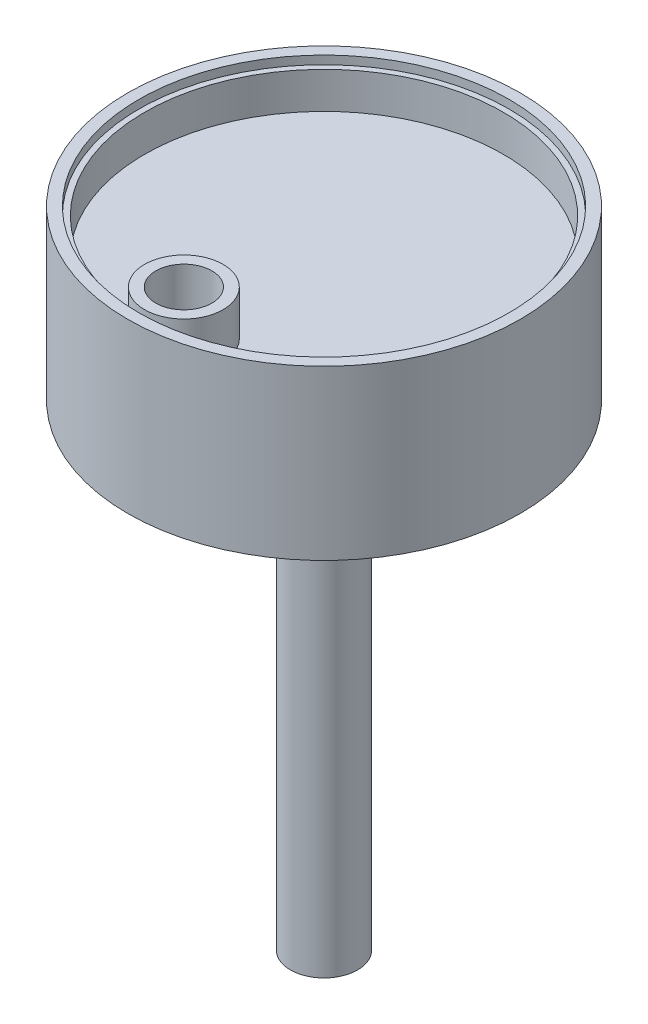
ISO-10303-21;
HEADER;
FILE_DESCRIPTION(('STEP AP214'),'2;1');
FILE_NAME('part.step','',(''),(''),'','','');
FILE_SCHEMA(('AUTOMOTIVE_DESIGN { 1 0 10303 214 1 1 1 1 }'));
ENDSEC;
DATA;
#1=APPLICATION_CONTEXT('core data for automotive mechanical design processes');
#2=APPLICATION_PROTOCOL_DEFINITION('international standard','automotive_design',2000,#1);
#3=PRODUCT_CONTEXT('',#1,'mechanical');
#4=PRODUCT('Part','Part','',(#3));
#5=PRODUCT_RELATED_PRODUCT_CATEGORY('part','',(#4));
#6=PRODUCT_DEFINITION_FORMATION('','',#4);
#7=PRODUCT_DEFINITION_CONTEXT('part definition',#1,'design');
#8=PRODUCT_DEFINITION('design','',#6,#7);
#9=PRODUCT_DEFINITION_SHAPE('','',#8);
#10=(LENGTH_UNIT() NAMED_UNIT(*) SI_UNIT(.MILLI.,.METRE.));
#11=(NAMED_UNIT(*) PLANE_ANGLE_UNIT() SI_UNIT($,.RADIAN.));
#12=(NAMED_UNIT(*) SI_UNIT($,.STERADIAN.) SOLID_ANGLE_UNIT());
#13=UNCERTAINTY_MEASURE_WITH_UNIT(LENGTH_MEASURE(1.E-05),#10,'distance_accuracy_value','');
#14=(GEOMETRIC_REPRESENTATION_CONTEXT(3) GLOBAL_UNCERTAINTY_ASSIGNED_CONTEXT((#13)) GLOBAL_UNIT_ASSIGNED_CONTEXT((#10,
#11,#12)) REPRESENTATION_CONTEXT('',''));
#15=CARTESIAN_POINT('',(0.,0.,0.));
#16=DIRECTION('',(0.,0.,1.));
#17=DIRECTION('',(1.,0.,0.));
#18=AXIS2_PLACEMENT_3D('',#15,#16,#17);
#19=CARTESIAN_POINT('',(0.,30.,25.));
#20=DIRECTION('',(0.,1.,0.));
#21=DIRECTION('',(0.,0.,1.));
#22=AXIS2_PLACEMENT_3D('',#19,#20,#21);
#23=PLANE('',#22);
#24=CARTESIAN_POINT('',(0.,30.,25.));
#25=DIRECTION('',(0.,1.,0.));
#26=DIRECTION('',(0.,0.,1.));
#27=AXIS2_PLACEMENT_3D('',#24,#25,#26);
#28=CIRCLE('',#27,7.);
#29=CARTESIAN_POINT('',(0.,30.,32.));
#30=VERTEX_POINT('',#29);
#31=EDGE_CURVE('E11',#30,#30,#28,.T.);
#32=ORIENTED_EDGE('',*,*,#31,.T.);
#33=EDGE_LOOP('',(#32));
#34=FACE_BOUND('',#33,.T.);
#35=CARTESIAN_POINT('',(0.,30.,25.));
#36=DIRECTION('',(0.,1.,0.));
#37=DIRECTION('',(0.,0.,1.));
#38=AXIS2_PLACEMENT_3D('',#35,#36,#37);
#39=CIRCLE('',#38,5.);
#40=CARTESIAN_POINT('',(0.,30.,30.));
#41=VERTEX_POINT('',#40);
#42=EDGE_CURVE('E58',#41,#41,#39,.T.);
#43=ORIENTED_EDGE('',*,*,#42,.F.);
#44=EDGE_LOOP('',(#43));
#45=FACE_BOUND('',#44,.T.);
#46=ADVANCED_FACE('F47',(#34,#45),#23,.T.);
#47=CARTESIAN_POINT('',(0.,22.,25.));
#48=DIRECTION('',(0.,1.,0.));
#49=DIRECTION('',(0.,0.,1.));
#50=AXIS2_PLACEMENT_3D('',#47,#48,#49);
#51=PLANE('',#50);
#52=CARTESIAN_POINT('',(0.,22.,25.));
#53=DIRECTION('',(0.,1.,0.));
#54=DIRECTION('',(0.,0.,1.));
#55=AXIS2_PLACEMENT_3D('',#52,#53,#54);
#56=CIRCLE('',#55,7.);
#57=CARTESIAN_POINT('',(0.,22.,32.));
#58=VERTEX_POINT('',#57);
#59=EDGE_CURVE('E51',#58,#58,#56,.T.);
#60=ORIENTED_EDGE('',*,*,#59,.F.);
#61=EDGE_LOOP('',(#60));
#62=FACE_BOUND('',#61,.T.);
#63=CARTESIAN_POINT('',(0.,22.,25.));
#64=DIRECTION('',(0.,1.,0.));
#65=DIRECTION('',(0.,0.,1.));
#66=AXIS2_PLACEMENT_3D('',#63,#64,#65);
#67=CIRCLE('',#66,5.);
#68=CARTESIAN_POINT('',(0.,22.,30.));
#69=VERTEX_POINT('',#68);
#70=EDGE_CURVE('E60',#69,#69,#67,.T.);
#71=ORIENTED_EDGE('',*,*,#70,.T.);
#72=EDGE_LOOP('',(#71));
#73=FACE_BOUND('',#72,.T.);
#74=ADVANCED_FACE('F70',(#62,#73),#51,.F.);
#75=CARTESIAN_POINT('',(0.,30.,25.));
#76=DIRECTION('',(0.,-1.,0.));
#77=DIRECTION('',(0.,0.,-1.));
#78=AXIS2_PLACEMENT_3D('',#75,#76,#77);
#79=CYLINDRICAL_SURFACE('',#78,7.);
#80=ORIENTED_EDGE('',*,*,#31,.F.);
#81=EDGE_LOOP('',(#80));
#82=FACE_BOUND('',#81,.T.);
#83=ORIENTED_EDGE('',*,*,#59,.T.);
#84=EDGE_LOOP('',(#83));
#85=FACE_BOUND('',#84,.T.);
#86=ADVANCED_FACE('F49',(#82,#85),#79,.T.);
#87=CARTESIAN_POINT('',(0.,30.,25.));
#88=DIRECTION('',(0.,-1.,0.));
#89=DIRECTION('',(0.,0.,-1.));
#90=AXIS2_PLACEMENT_3D('',#87,#88,#89);
#91=CYLINDRICAL_SURFACE('',#90,5.);
#92=ORIENTED_EDGE('',*,*,#42,.T.);
#93=EDGE_LOOP('',(#92));
#94=FACE_BOUND('',#93,.T.);
#95=ORIENTED_EDGE('',*,*,#70,.F.);
#96=EDGE_LOOP('',(#95));
#97=FACE_BOUND('',#96,.T.);
#98=ADVANCED_FACE('F66',(#94,#97),#91,.F.);
#99=CLOSED_SHELL('',(#46,#74,#86,#98));
#100=MANIFOLD_SOLID_BREP('B2',#99);
#101=CARTESIAN_POINT('',(0.,20.,0.));
#102=DIRECTION('',(0.,-1.,0.));
#103=DIRECTION('',(0.,0.,-1.));
#104=AXIS2_PLACEMENT_3D('',#101,#102,#103);
#105=CYLINDRICAL_SURFACE('',#104,35.);
#106=CARTESIAN_POINT('',(0.,0.,0.));
#107=DIRECTION('',(0.,1.,0.));
#108=DIRECTION('',(0.,0.,1.));
#109=AXIS2_PLACEMENT_3D('',#106,#107,#108);
#110=CIRCLE('',#109,35.);
#111=CARTESIAN_POINT('',(0.,0.,35.));
#112=VERTEX_POINT('',#111);
#113=EDGE_CURVE('E46',#112,#112,#110,.T.);
#114=ORIENTED_EDGE('',*,*,#113,.T.);
#115=EDGE_LOOP('',(#114));
#116=FACE_BOUND('',#115,.T.);
#117=CARTESIAN_POINT('',(0.,30.,0.));
#118=DIRECTION('',(0.,1.,0.));
#119=DIRECTION('',(0.,0.,1.));
#120=AXIS2_PLACEMENT_3D('',#117,#118,#119);
#121=CIRCLE('',#120,35.);
#122=CARTESIAN_POINT('',(0.,30.,35.));
#123=VERTEX_POINT('',#122);
#124=EDGE_CURVE('E139',#123,#123,#121,.T.);
#125=ORIENTED_EDGE('',*,*,#124,.F.);
#126=EDGE_LOOP('',(#125));
#127=FACE_BOUND('',#126,.T.);
#128=ADVANCED_FACE('F112',(#116,#127),#105,.T.);
#129=CARTESIAN_POINT('',(0.,0.,0.));
#130=DIRECTION('',(0.,1.,0.));
#131=DIRECTION('',(0.,0.,1.));
#132=AXIS2_PLACEMENT_3D('',#129,#130,#131);
#133=PLANE('',#132);
#134=CARTESIAN_POINT('',(0.,0.,0.));
#135=DIRECTION('',(0.,-1.,0.));
#136=DIRECTION('',(0.,0.,-1.));
#137=AXIS2_PLACEMENT_3D('',#134,#135,#136);
#138=CIRCLE('',#137,32.);
#139=CARTESIAN_POINT('',(0.,0.,-32.));
#140=VERTEX_POINT('',#139);
#141=EDGE_CURVE('E124',#140,#140,#138,.T.);
#142=ORIENTED_EDGE('',*,*,#141,.F.);
#143=EDGE_LOOP('',(#142));
#144=FACE_BOUND('',#143,.T.);
#145=ORIENTED_EDGE('',*,*,#113,.F.);
#146=EDGE_LOOP('',(#145));
#147=FACE_BOUND('',#146,.T.);
#148=ADVANCED_FACE('F192',(#144,#147),#133,.F.);
#149=CARTESIAN_POINT('',(0.,15.,0.));
#150=DIRECTION('',(0.,-1.,0.));
#151=DIRECTION('',(0.,0.,-1.));
#152=AXIS2_PLACEMENT_3D('',#149,#150,#151);
#153=CYLINDRICAL_SURFACE('',#152,32.);
#154=CARTESIAN_POINT('',(0.,15.,0.));
#155=DIRECTION('',(0.,-1.,0.));
#156=DIRECTION('',(0.,0.,-1.));
#157=AXIS2_PLACEMENT_3D('',#154,#155,#156);
#158=CIRCLE('',#157,32.);
#159=CARTESIAN_POINT('',(0.,15.,-32.));
#160=VERTEX_POINT('',#159);
#161=EDGE_CURVE('E120',#160,#160,#158,.T.);
#162=ORIENTED_EDGE('',*,*,#161,.F.);
#163=EDGE_LOOP('',(#162));
#164=FACE_BOUND('',#163,.T.);
#165=ORIENTED_EDGE('',*,*,#141,.T.);
#166=EDGE_LOOP('',(#165));
#167=FACE_BOUND('',#166,.T.);
#168=ADVANCED_FACE('F198',(#164,#167),#153,.F.);
#169=CARTESIAN_POINT('',(0.,15.,0.));
#170=DIRECTION('',(0.,-1.,0.));
#171=DIRECTION('',(0.,0.,-1.));
#172=AXIS2_PLACEMENT_3D('',#169,#170,#171);
#173=PLANE('',#172);
#174=CARTESIAN_POINT('',(0.,15.,25.));
#175=DIRECTION('',(0.,-1.,0.));
#176=DIRECTION('',(0.,0.,-1.));
#177=AXIS2_PLACEMENT_3D('',#174,#175,#176);
#178=CIRCLE('',#177,5.);
#179=CARTESIAN_POINT('',(0.,15.,30.));
#180=VERTEX_POINT('',#179);
#181=EDGE_CURVE('E151',#180,#180,#178,.T.);
#182=ORIENTED_EDGE('',*,*,#181,.F.);
#183=EDGE_LOOP('',(#182));
#184=FACE_BOUND('',#183,.T.);
#185=CARTESIAN_POINT('',(0.,15.,0.));
#186=DIRECTION('',(0.,-1.,0.));
#187=DIRECTION('',(0.,0.,-1.));
#188=AXIS2_PLACEMENT_3D('',#185,#186,#187);
#189=CIRCLE('',#188,6.);
#190=CARTESIAN_POINT('',(0.,15.,-6.));
#191=VERTEX_POINT('',#190);
#192=EDGE_CURVE('E130',#191,#191,#189,.T.);
#193=ORIENTED_EDGE('',*,*,#192,.F.);
#194=EDGE_LOOP('',(#193));
#195=FACE_BOUND('',#194,.T.);
#196=ORIENTED_EDGE('',*,*,#161,.T.);
#197=EDGE_LOOP('',(#196));
#198=FACE_BOUND('',#197,.T.);
#199=ADVANCED_FACE('F206',(#184,#195,#198),#173,.T.);
#200=CARTESIAN_POINT('',(0.,-85.,0.));
#201=DIRECTION('',(0.,1.,0.));
#202=DIRECTION('',(0.,0.,1.));
#203=AXIS2_PLACEMENT_3D('',#200,#201,#202);
#204=CYLINDRICAL_SURFACE('',#203,6.);
#205=CARTESIAN_POINT('',(0.,-85.,0.));
#206=DIRECTION('',(0.,-1.,0.));
#207=DIRECTION('',(0.,0.,-1.));
#208=AXIS2_PLACEMENT_3D('',#205,#206,#207);
#209=CIRCLE('',#208,6.);
#210=CARTESIAN_POINT('',(0.,-85.,-6.));
#211=VERTEX_POINT('',#210);
#212=EDGE_CURVE('E128',#211,#211,#209,.T.);
#213=ORIENTED_EDGE('',*,*,#212,.F.);
#214=EDGE_LOOP('',(#213));
#215=FACE_BOUND('',#214,.T.);
#216=ORIENTED_EDGE('',*,*,#192,.T.);
#217=EDGE_LOOP('',(#216));
#218=FACE_BOUND('',#217,.T.);
#219=ADVANCED_FACE('F214',(#215,#218),#204,.T.);
#220=CARTESIAN_POINT('',(0.,-85.,0.));
#221=DIRECTION('',(0.,-1.,0.));
#222=DIRECTION('',(0.,0.,-1.));
#223=AXIS2_PLACEMENT_3D('',#220,#221,#222);
#224=PLANE('',#223);
#225=ORIENTED_EDGE('',*,*,#212,.T.);
#226=EDGE_LOOP('',(#225));
#227=FACE_BOUND('',#226,.T.);
#228=ADVANCED_FACE('F187',(#227),#224,.T.);
#229=CARTESIAN_POINT('',(0.,30.,0.));
#230=DIRECTION('',(0.,1.,0.));
#231=DIRECTION('',(0.,0.,1.));
#232=AXIS2_PLACEMENT_3D('',#229,#230,#231);
#233=PLANE('',#232);
#234=CARTESIAN_POINT('',(0.,30.,0.));
#235=DIRECTION('',(0.,1.,0.));
#236=DIRECTION('',(0.,0.,1.));
#237=AXIS2_PLACEMENT_3D('',#234,#235,#236);
#238=CIRCLE('',#237,33.);
#239=CARTESIAN_POINT('',(0.,30.,33.));
#240=VERTEX_POINT('',#239);
#241=EDGE_CURVE('E147',#240,#240,#238,.T.);
#242=ORIENTED_EDGE('',*,*,#241,.F.);
#243=EDGE_LOOP('',(#242));
#244=FACE_BOUND('',#243,.T.);
#245=ORIENTED_EDGE('',*,*,#124,.T.);
#246=EDGE_LOOP('',(#245));
#247=FACE_BOUND('',#246,.T.);
#248=ADVANCED_FACE('F178',(#244,#247),#233,.T.);
#249=CARTESIAN_POINT('',(0.,28.5,0.));
#250=DIRECTION('',(0.,1.,0.));
#251=DIRECTION('',(0.,0.,1.));
#252=AXIS2_PLACEMENT_3D('',#249,#250,#251);
#253=PLANE('',#252);
#254=CARTESIAN_POINT('',(0.,28.5,0.));
#255=DIRECTION('',(0.,1.,0.));
#256=DIRECTION('',(0.,0.,1.));
#257=AXIS2_PLACEMENT_3D('',#254,#255,#256);
#258=CIRCLE('',#257,33.);
#259=CARTESIAN_POINT('',(0.,28.5,33.));
#260=VERTEX_POINT('',#259);
#261=EDGE_CURVE('E150',#260,#260,#258,.T.);
#262=ORIENTED_EDGE('',*,*,#261,.T.);
#263=EDGE_LOOP('',(#262));
#264=FACE_BOUND('',#263,.T.);
#265=CARTESIAN_POINT('',(0.,28.5,0.));
#266=DIRECTION('',(0.,1.,0.));
#267=DIRECTION('',(0.,0.,1.));
#268=AXIS2_PLACEMENT_3D('',#265,#266,#267);
#269=CIRCLE('',#268,32.);
#270=CARTESIAN_POINT('',(0.,28.5,32.));
#271=VERTEX_POINT('',#270);
#272=EDGE_CURVE('E115',#271,#271,#269,.F.);
#273=ORIENTED_EDGE('',*,*,#272,.T.);
#274=EDGE_LOOP('',(#273));
#275=FACE_BOUND('',#274,.T.);
#276=ADVANCED_FACE('F176',(#264,#275),#253,.T.);
#277=CARTESIAN_POINT('',(0.,28.5,0.));
#278=DIRECTION('',(0.,1.,0.));
#279=DIRECTION('',(0.,0.,1.));
#280=AXIS2_PLACEMENT_3D('',#277,#278,#279);
#281=CYLINDRICAL_SURFACE('',#280,33.);
#282=ORIENTED_EDGE('',*,*,#261,.F.);
#283=EDGE_LOOP('',(#282));
#284=FACE_BOUND('',#283,.T.);
#285=ORIENTED_EDGE('',*,*,#241,.T.);
#286=EDGE_LOOP('',(#285));
#287=FACE_BOUND('',#286,.T.);
#288=ADVANCED_FACE('F166',(#284,#287),#281,.F.);
#289=CARTESIAN_POINT('',(0.,22.,0.));
#290=DIRECTION('',(0.,1.,0.));
#291=DIRECTION('',(0.,0.,1.));
#292=AXIS2_PLACEMENT_3D('',#289,#290,#291);
#293=PLANE('',#292);
#294=CARTESIAN_POINT('',(0.,22.,25.));
#295=DIRECTION('',(0.,1.,0.));
#296=DIRECTION('',(0.,0.,1.));
#297=AXIS2_PLACEMENT_3D('',#294,#295,#296);
#298=CIRCLE('',#297,5.);
#299=CARTESIAN_POINT('',(0.,22.,30.));
#300=VERTEX_POINT('',#299);
#301=EDGE_CURVE('E156',#300,#300,#298,.T.);
#302=ORIENTED_EDGE('',*,*,#301,.F.);
#303=EDGE_LOOP('',(#302));
#304=FACE_BOUND('',#303,.T.);
#305=CARTESIAN_POINT('',(0.,22.,0.));
#306=DIRECTION('',(0.,1.,0.));
#307=DIRECTION('',(0.,0.,1.));
#308=AXIS2_PLACEMENT_3D('',#305,#306,#307);
#309=CIRCLE('',#308,32.);
#310=CARTESIAN_POINT('',(0.,22.,32.));
#311=VERTEX_POINT('',#310);
#312=EDGE_CURVE('E144',#311,#311,#309,.T.);
#313=ORIENTED_EDGE('',*,*,#312,.T.);
#314=EDGE_LOOP('',(#313));
#315=FACE_BOUND('',#314,.T.);
#316=ADVANCED_FACE('F162',(#304,#315),#293,.T.);
#317=CARTESIAN_POINT('',(0.,22.,0.));
#318=DIRECTION('',(0.,1.,0.));
#319=DIRECTION('',(0.,0.,1.));
#320=AXIS2_PLACEMENT_3D('',#317,#318,#319);
#321=CYLINDRICAL_SURFACE('',#320,32.);
#322=ORIENTED_EDGE('',*,*,#312,.F.);
#323=EDGE_LOOP('',(#322));
#324=FACE_BOUND('',#323,.T.);
#325=ORIENTED_EDGE('',*,*,#272,.F.);
#326=EDGE_LOOP('',(#325));
#327=FACE_BOUND('',#326,.T.);
#328=ADVANCED_FACE('F165',(#324,#327),#321,.F.);
#329=CARTESIAN_POINT('',(0.,-85.,25.));
#330=DIRECTION('',(0.,1.,0.));
#331=DIRECTION('',(0.,0.,1.));
#332=AXIS2_PLACEMENT_3D('',#329,#330,#331);
#333=CYLINDRICAL_SURFACE('',#332,5.);
#334=CARTESIAN_POINT('',(0.,15.,30.));
#335=CARTESIAN_POINT('',(0.,15.0729166666667,30.));
#336=CARTESIAN_POINT('',(0.,15.1458333333333,30.));
#337=CARTESIAN_POINT('',(0.,15.2916666666667,30.));
#338=CARTESIAN_POINT('',(0.,15.3645833333333,30.));
#339=CARTESIAN_POINT('',(0.,15.5104166666667,30.));
#340=CARTESIAN_POINT('',(0.,15.5833333333333,30.));
#341=CARTESIAN_POINT('',(0.,15.7291666666667,30.));
#342=CARTESIAN_POINT('',(0.,15.8020833333333,30.));
#343=CARTESIAN_POINT('',(0.,15.9479166666667,30.));
#344=CARTESIAN_POINT('',(0.,16.0208333333333,30.));
#345=CARTESIAN_POINT('',(0.,16.1666666666667,30.));
#346=CARTESIAN_POINT('',(0.,16.2395833333333,30.));
#347=CARTESIAN_POINT('',(0.,16.3854166666667,30.));
#348=CARTESIAN_POINT('',(0.,16.4583333333333,30.));
#349=CARTESIAN_POINT('',(0.,16.6041666666667,30.));
#350=CARTESIAN_POINT('',(0.,16.6770833333333,30.));
#351=CARTESIAN_POINT('',(0.,16.8229166666667,30.));
#352=CARTESIAN_POINT('',(0.,16.8958333333333,30.));
#353=CARTESIAN_POINT('',(0.,17.0416666666667,30.));
#354=CARTESIAN_POINT('',(0.,17.1145833333333,30.));
#355=CARTESIAN_POINT('',(0.,17.2604166666667,30.));
#356=CARTESIAN_POINT('',(0.,17.3333333333333,30.));
#357=CARTESIAN_POINT('',(0.,17.4791666666667,30.));
#358=CARTESIAN_POINT('',(0.,17.5520833333333,30.));
#359=CARTESIAN_POINT('',(0.,17.6979166666667,30.));
#360=CARTESIAN_POINT('',(0.,17.7708333333333,30.));
#361=CARTESIAN_POINT('',(0.,17.9166666666667,30.));
#362=CARTESIAN_POINT('',(0.,17.9895833333333,30.));
#363=CARTESIAN_POINT('',(0.,18.1354166666667,30.));
#364=CARTESIAN_POINT('',(0.,18.2083333333333,30.));
#365=CARTESIAN_POINT('',(0.,18.3541666666667,30.));
#366=CARTESIAN_POINT('',(0.,18.4270833333333,30.));
#367=CARTESIAN_POINT('',(0.,18.5729166666667,30.));
#368=CARTESIAN_POINT('',(0.,18.6458333333333,30.));
#369=CARTESIAN_POINT('',(0.,18.7916666666667,30.));
#370=CARTESIAN_POINT('',(0.,18.8645833333333,30.));
#371=CARTESIAN_POINT('',(0.,19.0104166666667,30.));
#372=CARTESIAN_POINT('',(0.,19.0833333333333,30.));
#373=CARTESIAN_POINT('',(0.,19.2291666666667,30.));
#374=CARTESIAN_POINT('',(0.,19.3020833333333,30.));
#375=CARTESIAN_POINT('',(0.,19.4479166666667,30.));
#376=CARTESIAN_POINT('',(0.,19.5208333333333,30.));
#377=CARTESIAN_POINT('',(0.,19.6666666666667,30.));
#378=CARTESIAN_POINT('',(0.,19.7395833333333,30.));
#379=CARTESIAN_POINT('',(0.,19.8854166666667,30.));
#380=CARTESIAN_POINT('',(0.,19.9583333333333,30.));
#381=CARTESIAN_POINT('',(0.,20.1041666666667,30.));
#382=CARTESIAN_POINT('',(0.,20.1770833333333,30.));
#383=CARTESIAN_POINT('',(0.,20.3229166666667,30.));
#384=CARTESIAN_POINT('',(0.,20.3958333333333,30.));
#385=CARTESIAN_POINT('',(0.,20.5416666666667,30.));
#386=CARTESIAN_POINT('',(0.,20.6145833333333,30.));
#387=CARTESIAN_POINT('',(0.,20.7604166666667,30.));
#388=CARTESIAN_POINT('',(0.,20.8333333333333,30.));
#389=CARTESIAN_POINT('',(0.,20.9791666666667,30.));
#390=CARTESIAN_POINT('',(0.,21.0520833333333,30.));
#391=CARTESIAN_POINT('',(0.,21.1979166666667,30.));
#392=CARTESIAN_POINT('',(0.,21.2708333333333,30.));
#393=CARTESIAN_POINT('',(0.,21.4166666666667,30.));
#394=CARTESIAN_POINT('',(0.,21.4895833333333,30.));
#395=CARTESIAN_POINT('',(0.,21.6354166666667,30.));
#396=CARTESIAN_POINT('',(0.,21.7083333333333,30.));
#397=CARTESIAN_POINT('',(0.,21.8541666666667,30.));
#398=CARTESIAN_POINT('',(0.,21.9270833333333,30.));
#399=CARTESIAN_POINT('',(0.,22.,30.));
#400=B_SPLINE_CURVE_WITH_KNOTS('',3,(#334,#335,#336,#337,#338,#339,#340,#341,#342,#343,#344,
#345,#346,#347,#348,#349,#350,#351,#352,#353,#354,#355,#356,#357,#358,#359,#360,#361,#362,#363,
#364,#365,#366,#367,#368,#369,#370,#371,#372,#373,#374,#375,#376,#377,#378,#379,#380,#381,#382,
#383,#384,#385,#386,#387,#388,#389,#390,#391,#392,#393,#394,#395,#396,#397,#398,#399),
.UNSPECIFIED.,.F.,.F.,(4,2,2,2,2,2,2,2,2,2,2,2,2,2,2,2,2,2,2,2,2,2,2,2,2,2,2,2,2,2,2,2,4),(0.,
0.218750000000004,0.437500000000007,0.656249999999997,0.875000000000001,1.09375,
1.31249999999999,1.53125,1.75,1.96875000000001,2.18750000000001,2.40625,2.625,2.84375000000001,
3.0625,3.28125,3.5,3.71875000000001,3.93750000000001,4.15625,4.375,4.59375000000001,4.8125,
5.03125,5.25,5.46875000000001,5.68750000000001,5.90625,6.12500000000001,6.34375000000001,6.5625,
6.78125,7.00000000000001),.UNSPECIFIED.);
#401=EDGE_CURVE('BSEAM160',#180,#300,#400,.T.);
#402=ORIENTED_EDGE('',*,*,#181,.T.);
#403=ORIENTED_EDGE('',*,*,#301,.T.);
#404=ORIENTED_EDGE('',*,*,#401,.T.);
#405=ORIENTED_EDGE('',*,*,#401,.F.);
#406=EDGE_LOOP('',(#402,#404,#403,#405));
#407=FACE_BOUND('',#406,.T.);
#408=ADVANCED_FACE('F160',(#407),#333,.F.);
#409=CLOSED_SHELL('',(#128,#148,#168,#199,#219,#228,#248,#276,#288,#316,#328,#408));
#410=CARTESIAN_POINT('',(0.,-75.,0.));
#411=DIRECTION('',(0.,1.,0.));
#412=DIRECTION('',(0.,0.,1.));
#413=AXIS2_PLACEMENT_3D('',#410,#411,#412);
#414=PLANE('',#413);
#415=CARTESIAN_POINT('',(0.,-75.,0.));
#416=DIRECTION('',(0.,1.,0.));
#417=DIRECTION('',(0.,0.,1.));
#418=AXIS2_PLACEMENT_3D('',#415,#416,#417);
#419=CIRCLE('',#418,4.);
#420=CARTESIAN_POINT('',(0.,-75.,4.));
#421=VERTEX_POINT('',#420);
#422=EDGE_CURVE('E133',#421,#421,#419,.T.);
#423=ORIENTED_EDGE('',*,*,#422,.T.);
#424=EDGE_LOOP('',(#423));
#425=FACE_BOUND('',#424,.T.);
#426=ADVANCED_FACE('F226',(#425),#414,.T.);
#427=CARTESIAN_POINT('',(0.,-75.,0.));
#428=DIRECTION('',(0.,1.,0.));
#429=DIRECTION('',(0.,0.,1.));
#430=AXIS2_PLACEMENT_3D('',#427,#428,#429);
#431=CYLINDRICAL_SURFACE('',#430,4.);
#432=ORIENTED_EDGE('',*,*,#422,.F.);
#433=EDGE_LOOP('',(#432));
#434=FACE_BOUND('',#433,.T.);
#435=CARTESIAN_POINT('',(0.,20.,0.));
#436=DIRECTION('',(0.,1.,0.));
#437=DIRECTION('',(0.,0.,1.));
#438=AXIS2_PLACEMENT_3D('',#435,#436,#437);
#439=CIRCLE('',#438,4.);
#440=CARTESIAN_POINT('',(0.,20.,4.));
#441=VERTEX_POINT('',#440);
#442=EDGE_CURVE('E136',#441,#441,#439,.T.);
#443=ORIENTED_EDGE('',*,*,#442,.T.);
#444=EDGE_LOOP('',(#443));
#445=FACE_BOUND('',#444,.T.);
#446=ADVANCED_FACE('F222',(#434,#445),#431,.F.);
#447=CARTESIAN_POINT('',(0.,20.,0.));
#448=DIRECTION('',(0.,1.,0.));
#449=DIRECTION('',(0.,0.,1.));
#450=AXIS2_PLACEMENT_3D('',#447,#448,#449);
#451=PLANE('',#450);
#452=ORIENTED_EDGE('',*,*,#442,.F.);
#453=EDGE_LOOP('',(#452));
#454=FACE_BOUND('',#453,.T.);
#455=ADVANCED_FACE('F225',(#454),#451,.F.);
#456=CLOSED_SHELL('',(#426,#446,#455));
#457=ORIENTED_CLOSED_SHELL('',*,#456,.T.);
#458=BREP_WITH_VOIDS('B6',#409,(#457));
#459=ADVANCED_BREP_SHAPE_REPRESENTATION('',(#18,#100,#458),#14);
#460=SHAPE_DEFINITION_REPRESENTATION(#9,#459);
ENDSEC;
END-ISO-10303-21;
